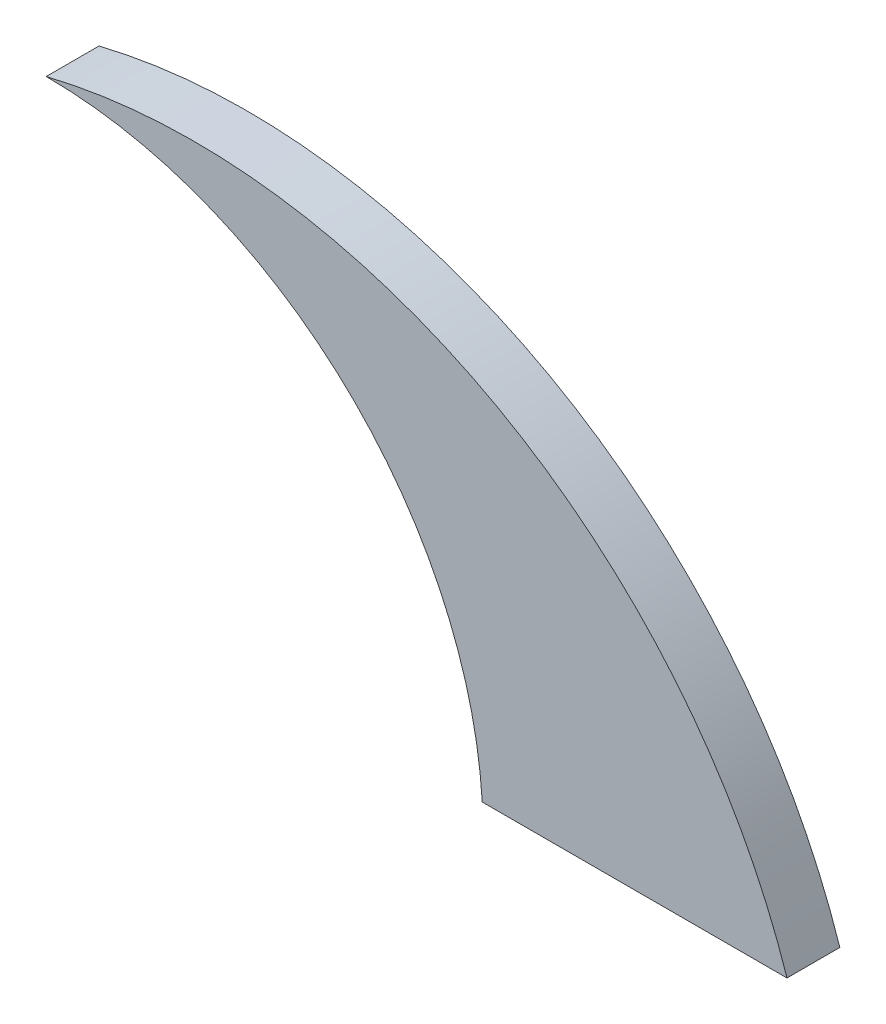
ISO-10303-21;
HEADER;
FILE_DESCRIPTION(('STEP AP214'),'2;1');
FILE_NAME('part.step','',(''),(''),'','','');
FILE_SCHEMA(('AUTOMOTIVE_DESIGN { 1 0 10303 214 1 1 1 1 }'));
ENDSEC;
DATA;
#1=APPLICATION_CONTEXT('core data for automotive mechanical design processes');
#2=APPLICATION_PROTOCOL_DEFINITION('international standard','automotive_design',2000,#1);
#3=PRODUCT_CONTEXT('',#1,'mechanical');
#4=PRODUCT('Part','Part','',(#3));
#5=PRODUCT_RELATED_PRODUCT_CATEGORY('part','',(#4));
#6=PRODUCT_DEFINITION_FORMATION('','',#4);
#7=PRODUCT_DEFINITION_CONTEXT('part definition',#1,'design');
#8=PRODUCT_DEFINITION('design','',#6,#7);
#9=PRODUCT_DEFINITION_SHAPE('','',#8);
#10=(LENGTH_UNIT() NAMED_UNIT(*) SI_UNIT(.MILLI.,.METRE.));
#11=(NAMED_UNIT(*) PLANE_ANGLE_UNIT() SI_UNIT($,.RADIAN.));
#12=(NAMED_UNIT(*) SI_UNIT($,.STERADIAN.) SOLID_ANGLE_UNIT());
#13=UNCERTAINTY_MEASURE_WITH_UNIT(LENGTH_MEASURE(1.E-05),#10,'distance_accuracy_value','');
#14=(GEOMETRIC_REPRESENTATION_CONTEXT(3) GLOBAL_UNCERTAINTY_ASSIGNED_CONTEXT((#13)) GLOBAL_UNIT_ASSIGNED_CONTEXT((#10,
#11,#12)) REPRESENTATION_CONTEXT('',''));
#15=CARTESIAN_POINT('',(0.,0.,0.));
#16=DIRECTION('',(0.,0.,1.));
#17=DIRECTION('',(1.,0.,0.));
#18=AXIS2_PLACEMENT_3D('',#15,#16,#17);
#19=CARTESIAN_POINT('',(35.6291876724226,-40.7071068472752,12.7));
#20=DIRECTION('',(0.,0.,-1.));
#21=DIRECTION('',(-1.,0.,0.));
#22=AXIS2_PLACEMENT_3D('',#19,#20,#21);
#23=CYLINDRICAL_SURFACE('',#22,150.);
#24=CARTESIAN_POINT('',(35.6291876724226,-40.7071068472752,0.));
#25=DIRECTION('',(0.,0.,1.));
#26=DIRECTION('',(-1.,0.,0.));
#27=AXIS2_PLACEMENT_3D('',#24,#25,#26);
#28=CIRCLE('',#27,150.);
#29=CARTESIAN_POINT('',(178.040284446794,6.4,0.));
#30=VERTEX_POINT('',#29);
#31=CARTESIAN_POINT('',(0.,105.,0.));
#32=VERTEX_POINT('',#31);
#33=EDGE_CURVE('E81',#30,#32,#28,.T.);
#34=ORIENTED_EDGE('',*,*,#33,.T.);
#35=DIRECTION('',(0.,0.,-1.));
#36=VECTOR('',#35,1.);
#37=CARTESIAN_POINT('',(0.,105.,12.7));
#38=LINE('',#37,#36);
#39=CARTESIAN_POINT('',(0.,105.,12.7));
#40=VERTEX_POINT('',#39);
#41=EDGE_CURVE('E11',#40,#32,#38,.T.);
#42=ORIENTED_EDGE('',*,*,#41,.F.);
#43=CARTESIAN_POINT('',(35.6291876724226,-40.7071068472752,12.7));
#44=DIRECTION('',(0.,0.,1.));
#45=DIRECTION('',(-1.,0.,0.));
#46=AXIS2_PLACEMENT_3D('',#43,#44,#45);
#47=CIRCLE('',#46,150.);
#48=CARTESIAN_POINT('',(178.040284446794,6.4,12.7));
#49=VERTEX_POINT('',#48);
#50=EDGE_CURVE('E74',#49,#40,#47,.T.);
#51=ORIENTED_EDGE('',*,*,#50,.F.);
#52=DIRECTION('',(0.,0.,-1.));
#53=VECTOR('',#52,1.);
#54=CARTESIAN_POINT('',(178.040284446794,6.4,12.7));
#55=LINE('',#54,#53);
#56=EDGE_CURVE('E82',#49,#30,#55,.T.);
#57=ORIENTED_EDGE('',*,*,#56,.T.);
#58=EDGE_LOOP('',(#34,#42,#51,#57));
#59=FACE_BOUND('',#58,.T.);
#60=ADVANCED_FACE('F34',(#59),#23,.T.);
#61=CARTESIAN_POINT('',(0.,0.,12.7));
#62=DIRECTION('',(0.,0.,-1.));
#63=DIRECTION('',(-1.,0.,0.));
#64=AXIS2_PLACEMENT_3D('',#61,#62,#63);
#65=CYLINDRICAL_SURFACE('',#64,105.);
#66=CARTESIAN_POINT('',(0.,0.,0.));
#67=DIRECTION('',(0.,0.,-1.));
#68=DIRECTION('',(-1.,0.,0.));
#69=AXIS2_PLACEMENT_3D('',#66,#67,#68);
#70=CIRCLE('',#69,105.);
#71=CARTESIAN_POINT('',(104.804770883772,6.40000000000002,0.));
#72=VERTEX_POINT('',#71);
#73=EDGE_CURVE('E62',#32,#72,#70,.T.);
#74=ORIENTED_EDGE('',*,*,#73,.T.);
#75=DIRECTION('',(0.,0.,-1.));
#76=VECTOR('',#75,1.);
#77=CARTESIAN_POINT('',(104.804770883772,6.40000000000002,12.7));
#78=LINE('',#77,#76);
#79=CARTESIAN_POINT('',(104.804770883772,6.40000000000002,12.7));
#80=VERTEX_POINT('',#79);
#81=EDGE_CURVE('E42',#80,#72,#78,.T.);
#82=ORIENTED_EDGE('',*,*,#81,.F.);
#83=CARTESIAN_POINT('',(0.,0.,12.7));
#84=DIRECTION('',(0.,0.,-1.));
#85=DIRECTION('',(-1.,0.,0.));
#86=AXIS2_PLACEMENT_3D('',#83,#84,#85);
#87=CIRCLE('',#86,105.);
#88=EDGE_CURVE('E70',#40,#80,#87,.T.);
#89=ORIENTED_EDGE('',*,*,#88,.F.);
#90=ORIENTED_EDGE('',*,*,#41,.T.);
#91=EDGE_LOOP('',(#74,#82,#89,#90));
#92=FACE_BOUND('',#91,.T.);
#93=ADVANCED_FACE('F71',(#92),#65,.F.);
#94=CARTESIAN_POINT('',(104.804770883772,6.4,12.7));
#95=DIRECTION('',(0.,1.,0.));
#96=DIRECTION('',(-1.,0.,0.));
#97=AXIS2_PLACEMENT_3D('',#94,#95,#96);
#98=PLANE('',#97);
#99=DIRECTION('',(1.,0.,0.));
#100=VECTOR('',#99,1.);
#101=CARTESIAN_POINT('',(104.804770883772,6.4,0.));
#102=LINE('',#101,#100);
#103=EDGE_CURVE('E67',#72,#30,#102,.T.);
#104=ORIENTED_EDGE('',*,*,#103,.T.);
#105=ORIENTED_EDGE('',*,*,#56,.F.);
#106=DIRECTION('',(1.,0.,0.));
#107=VECTOR('',#106,1.);
#108=CARTESIAN_POINT('',(104.804770883772,6.4,12.7));
#109=LINE('',#108,#107);
#110=EDGE_CURVE('E50',#80,#49,#109,.T.);
#111=ORIENTED_EDGE('',*,*,#110,.F.);
#112=ORIENTED_EDGE('',*,*,#81,.T.);
#113=EDGE_LOOP('',(#104,#105,#111,#112));
#114=FACE_BOUND('',#113,.T.);
#115=ADVANCED_FACE('F89',(#114),#98,.F.);
#116=CARTESIAN_POINT('',(35.6291876724226,-40.7071068472752,12.7));
#117=DIRECTION('',(0.,0.,-1.));
#118=DIRECTION('',(-1.,0.,0.));
#119=AXIS2_PLACEMENT_3D('',#116,#117,#118);
#120=PLANE('',#119);
#121=ORIENTED_EDGE('',*,*,#50,.T.);
#122=ORIENTED_EDGE('',*,*,#88,.T.);
#123=ORIENTED_EDGE('',*,*,#110,.T.);
#124=EDGE_LOOP('',(#121,#122,#123));
#125=FACE_BOUND('',#124,.T.);
#126=ADVANCED_FACE('F77',(#125),#120,.F.);
#127=CARTESIAN_POINT('',(35.6291876724226,-40.7071068472752,0.));
#128=DIRECTION('',(0.,0.,-1.));
#129=DIRECTION('',(-1.,0.,0.));
#130=AXIS2_PLACEMENT_3D('',#127,#128,#129);
#131=PLANE('',#130);
#132=ORIENTED_EDGE('',*,*,#33,.F.);
#133=ORIENTED_EDGE('',*,*,#103,.F.);
#134=ORIENTED_EDGE('',*,*,#73,.F.);
#135=EDGE_LOOP('',(#132,#133,#134));
#136=FACE_BOUND('',#135,.T.);
#137=ADVANCED_FACE('F90',(#136),#131,.T.);
#138=CLOSED_SHELL('',(#60,#93,#115,#126,#137));
#139=MANIFOLD_SOLID_BREP('B2',#138);
#140=ADVANCED_BREP_SHAPE_REPRESENTATION('',(#18,#139),#14);
#141=SHAPE_DEFINITION_REPRESENTATION(#9,#140);
ENDSEC;
END-ISO-10303-21;
